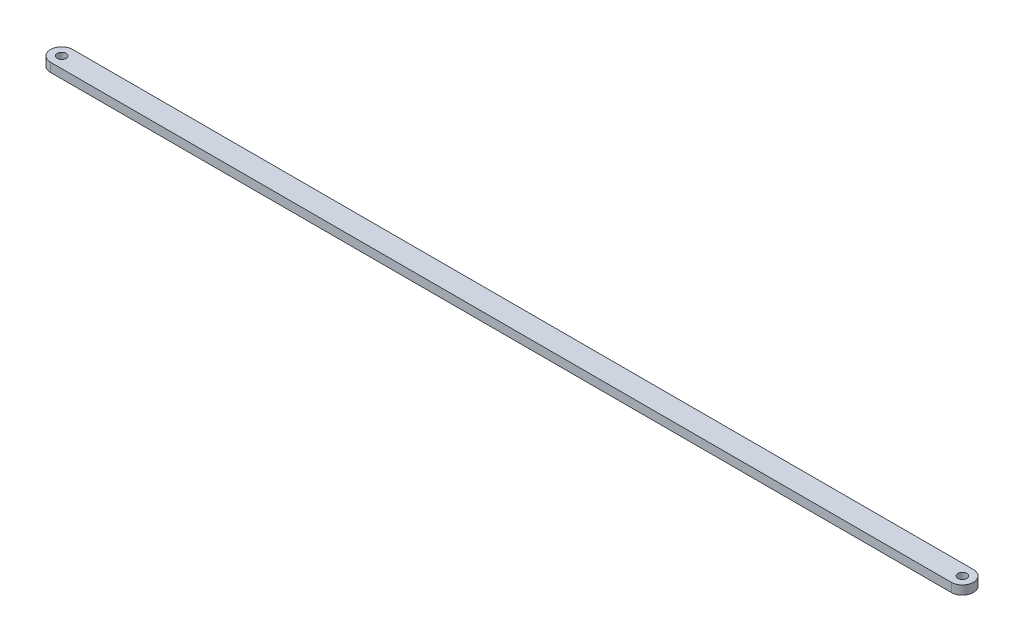
ISO-10303-21;
HEADER;
FILE_DESCRIPTION(('STEP AP214'),'2;1');
FILE_NAME('part.step','',(''),(''),'','','');
FILE_SCHEMA(('AUTOMOTIVE_DESIGN { 1 0 10303 214 1 1 1 1 }'));
ENDSEC;
DATA;
#1=APPLICATION_CONTEXT('core data for automotive mechanical design processes');
#2=APPLICATION_PROTOCOL_DEFINITION('international standard','automotive_design',2000,#1);
#3=PRODUCT_CONTEXT('',#1,'mechanical');
#4=PRODUCT('Part','Part','',(#3));
#5=PRODUCT_RELATED_PRODUCT_CATEGORY('part','',(#4));
#6=PRODUCT_DEFINITION_FORMATION('','',#4);
#7=PRODUCT_DEFINITION_CONTEXT('part definition',#1,'design');
#8=PRODUCT_DEFINITION('design','',#6,#7);
#9=PRODUCT_DEFINITION_SHAPE('','',#8);
#10=(LENGTH_UNIT() NAMED_UNIT(*) SI_UNIT(.MILLI.,.METRE.));
#11=(NAMED_UNIT(*) PLANE_ANGLE_UNIT() SI_UNIT($,.RADIAN.));
#12=(NAMED_UNIT(*) SI_UNIT($,.STERADIAN.) SOLID_ANGLE_UNIT());
#13=UNCERTAINTY_MEASURE_WITH_UNIT(LENGTH_MEASURE(1.E-05),#10,'distance_accuracy_value','');
#14=(GEOMETRIC_REPRESENTATION_CONTEXT(3) GLOBAL_UNCERTAINTY_ASSIGNED_CONTEXT((#13)) GLOBAL_UNIT_ASSIGNED_CONTEXT((#10,
#11,#12)) REPRESENTATION_CONTEXT('',''));
#15=CARTESIAN_POINT('',(0.,0.,0.));
#16=DIRECTION('',(0.,0.,1.));
#17=DIRECTION('',(1.,0.,0.));
#18=AXIS2_PLACEMENT_3D('',#15,#16,#17);
#19=CARTESIAN_POINT('',(-203.5,2.,0.));
#20=DIRECTION('',(0.,1.,0.));
#21=DIRECTION('',(0.,0.,1.));
#22=AXIS2_PLACEMENT_3D('',#19,#20,#21);
#23=PLANE('',#22);
#24=CARTESIAN_POINT('',(203.5,2.,0.));
#25=DIRECTION('',(0.,1.,0.));
#26=DIRECTION('',(0.,0.,1.));
#27=AXIS2_PLACEMENT_3D('',#24,#25,#26);
#28=CIRCLE('',#27,2.);
#29=CARTESIAN_POINT('',(203.5,2.,2.));
#30=VERTEX_POINT('',#29);
#31=EDGE_CURVE('E99',#30,#30,#28,.T.);
#32=ORIENTED_EDGE('',*,*,#31,.F.);
#33=EDGE_LOOP('',(#32));
#34=FACE_BOUND('',#33,.T.);
#35=CARTESIAN_POINT('',(-203.5,2.,0.));
#36=DIRECTION('',(0.,1.,0.));
#37=DIRECTION('',(0.,0.,1.));
#38=AXIS2_PLACEMENT_3D('',#35,#36,#37);
#39=CIRCLE('',#38,5.);
#40=CARTESIAN_POINT('',(-203.5,2.,-5.));
#41=VERTEX_POINT('',#40);
#42=CARTESIAN_POINT('',(-203.5,2.,5.));
#43=VERTEX_POINT('',#42);
#44=EDGE_CURVE('E84',#41,#43,#39,.T.);
#45=ORIENTED_EDGE('',*,*,#44,.T.);
#46=DIRECTION('',(1.,0.,0.));
#47=VECTOR('',#46,1.);
#48=CARTESIAN_POINT('',(-203.5,2.,5.));
#49=LINE('',#48,#47);
#50=CARTESIAN_POINT('',(203.5,2.,5.));
#51=VERTEX_POINT('',#50);
#52=EDGE_CURVE('E79',#43,#51,#49,.T.);
#53=ORIENTED_EDGE('',*,*,#52,.T.);
#54=CARTESIAN_POINT('',(203.5,2.,0.));
#55=DIRECTION('',(0.,1.,0.));
#56=DIRECTION('',(0.,0.,1.));
#57=AXIS2_PLACEMENT_3D('',#54,#55,#56);
#58=CIRCLE('',#57,5.);
#59=CARTESIAN_POINT('',(203.5,2.,-5.));
#60=VERTEX_POINT('',#59);
#61=EDGE_CURVE('E82',#51,#60,#58,.T.);
#62=ORIENTED_EDGE('',*,*,#61,.T.);
#63=DIRECTION('',(-1.,0.,0.));
#64=VECTOR('',#63,1.);
#65=CARTESIAN_POINT('',(-203.5,2.,-5.));
#66=LINE('',#65,#64);
#67=EDGE_CURVE('E49',#60,#41,#66,.T.);
#68=ORIENTED_EDGE('',*,*,#67,.T.);
#69=EDGE_LOOP('',(#45,#53,#62,#68));
#70=FACE_BOUND('',#69,.T.);
#71=CARTESIAN_POINT('',(-203.5,2.,0.));
#72=DIRECTION('',(0.,1.,0.));
#73=DIRECTION('',(0.,0.,-1.));
#74=AXIS2_PLACEMENT_3D('',#71,#72,#73);
#75=CIRCLE('',#74,2.);
#76=CARTESIAN_POINT('',(-203.5,2.,-2.));
#77=VERTEX_POINT('',#76);
#78=EDGE_CURVE('E114',#77,#77,#75,.T.);
#79=ORIENTED_EDGE('',*,*,#78,.F.);
#80=EDGE_LOOP('',(#79));
#81=FACE_BOUND('',#80,.T.);
#82=ADVANCED_FACE('F32',(#34,#70,#81),#23,.T.);
#83=CARTESIAN_POINT('',(-203.5,-2.,0.));
#84=DIRECTION('',(0.,1.,0.));
#85=DIRECTION('',(0.,0.,1.));
#86=AXIS2_PLACEMENT_3D('',#83,#84,#85);
#87=PLANE('',#86);
#88=CARTESIAN_POINT('',(203.5,-2.,0.));
#89=DIRECTION('',(0.,1.,0.));
#90=DIRECTION('',(0.,0.,1.));
#91=AXIS2_PLACEMENT_3D('',#88,#89,#90);
#92=CIRCLE('',#91,2.);
#93=CARTESIAN_POINT('',(203.5,-2.,2.));
#94=VERTEX_POINT('',#93);
#95=EDGE_CURVE('E111',#94,#94,#92,.T.);
#96=ORIENTED_EDGE('',*,*,#95,.T.);
#97=EDGE_LOOP('',(#96));
#98=FACE_BOUND('',#97,.T.);
#99=CARTESIAN_POINT('',(-203.5,-2.,0.));
#100=DIRECTION('',(0.,1.,0.));
#101=DIRECTION('',(0.,0.,1.));
#102=AXIS2_PLACEMENT_3D('',#99,#100,#101);
#103=CIRCLE('',#102,5.);
#104=CARTESIAN_POINT('',(-203.5,-2.,-5.));
#105=VERTEX_POINT('',#104);
#106=CARTESIAN_POINT('',(-203.5,-2.,5.));
#107=VERTEX_POINT('',#106);
#108=EDGE_CURVE('E96',#105,#107,#103,.T.);
#109=ORIENTED_EDGE('',*,*,#108,.F.);
#110=DIRECTION('',(-1.,0.,0.));
#111=VECTOR('',#110,1.);
#112=CARTESIAN_POINT('',(-203.5,-2.,-5.));
#113=LINE('',#112,#111);
#114=CARTESIAN_POINT('',(203.5,-2.,-5.));
#115=VERTEX_POINT('',#114);
#116=EDGE_CURVE('E72',#115,#105,#113,.T.);
#117=ORIENTED_EDGE('',*,*,#116,.F.);
#118=CARTESIAN_POINT('',(203.5,-2.,0.));
#119=DIRECTION('',(0.,1.,0.));
#120=DIRECTION('',(0.,0.,1.));
#121=AXIS2_PLACEMENT_3D('',#118,#119,#120);
#122=CIRCLE('',#121,5.);
#123=CARTESIAN_POINT('',(203.5,-2.,5.));
#124=VERTEX_POINT('',#123);
#125=EDGE_CURVE('E66',#124,#115,#122,.T.);
#126=ORIENTED_EDGE('',*,*,#125,.F.);
#127=DIRECTION('',(1.,0.,0.));
#128=VECTOR('',#127,1.);
#129=CARTESIAN_POINT('',(-203.5,-2.,5.));
#130=LINE('',#129,#128);
#131=EDGE_CURVE('E88',#107,#124,#130,.T.);
#132=ORIENTED_EDGE('',*,*,#131,.F.);
#133=EDGE_LOOP('',(#109,#117,#126,#132));
#134=FACE_BOUND('',#133,.T.);
#135=CARTESIAN_POINT('',(-203.5,-2.,0.));
#136=DIRECTION('',(0.,1.,0.));
#137=DIRECTION('',(0.,0.,-1.));
#138=AXIS2_PLACEMENT_3D('',#135,#136,#137);
#139=CIRCLE('',#138,2.);
#140=CARTESIAN_POINT('',(-203.5,-2.,-2.));
#141=VERTEX_POINT('',#140);
#142=EDGE_CURVE('E117',#141,#141,#139,.T.);
#143=ORIENTED_EDGE('',*,*,#142,.T.);
#144=EDGE_LOOP('',(#143));
#145=FACE_BOUND('',#144,.T.);
#146=ADVANCED_FACE('F107',(#98,#134,#145),#87,.F.);
#147=CARTESIAN_POINT('',(-203.5,2.,0.));
#148=DIRECTION('',(0.,-1.,0.));
#149=DIRECTION('',(0.,0.,-1.));
#150=AXIS2_PLACEMENT_3D('',#147,#148,#149);
#151=CYLINDRICAL_SURFACE('',#150,5.);
#152=ORIENTED_EDGE('',*,*,#108,.T.);
#153=DIRECTION('',(0.,-1.,0.));
#154=VECTOR('',#153,1.);
#155=CARTESIAN_POINT('',(-203.5,2.,5.));
#156=LINE('',#155,#154);
#157=EDGE_CURVE('E11',#43,#107,#156,.T.);
#158=ORIENTED_EDGE('',*,*,#157,.F.);
#159=ORIENTED_EDGE('',*,*,#44,.F.);
#160=DIRECTION('',(0.,-1.,0.));
#161=VECTOR('',#160,1.);
#162=CARTESIAN_POINT('',(-203.5,2.,-5.));
#163=LINE('',#162,#161);
#164=EDGE_CURVE('E92',#41,#105,#163,.T.);
#165=ORIENTED_EDGE('',*,*,#164,.T.);
#166=EDGE_LOOP('',(#152,#158,#159,#165));
#167=FACE_BOUND('',#166,.T.);
#168=ADVANCED_FACE('F34',(#167),#151,.T.);
#169=CARTESIAN_POINT('',(-203.5,2.,5.));
#170=DIRECTION('',(0.,0.,-1.));
#171=DIRECTION('',(-1.,0.,0.));
#172=AXIS2_PLACEMENT_3D('',#169,#170,#171);
#173=PLANE('',#172);
#174=ORIENTED_EDGE('',*,*,#131,.T.);
#175=DIRECTION('',(0.,-1.,0.));
#176=VECTOR('',#175,1.);
#177=CARTESIAN_POINT('',(203.5,2.,5.));
#178=LINE('',#177,#176);
#179=EDGE_CURVE('E41',#51,#124,#178,.T.);
#180=ORIENTED_EDGE('',*,*,#179,.F.);
#181=ORIENTED_EDGE('',*,*,#52,.F.);
#182=ORIENTED_EDGE('',*,*,#157,.T.);
#183=EDGE_LOOP('',(#174,#180,#181,#182));
#184=FACE_BOUND('',#183,.T.);
#185=ADVANCED_FACE('F87',(#184),#173,.F.);
#186=CARTESIAN_POINT('',(203.5,2.,0.));
#187=DIRECTION('',(0.,-1.,0.));
#188=DIRECTION('',(0.,0.,-1.));
#189=AXIS2_PLACEMENT_3D('',#186,#187,#188);
#190=CYLINDRICAL_SURFACE('',#189,5.);
#191=ORIENTED_EDGE('',*,*,#125,.T.);
#192=DIRECTION('',(0.,-1.,0.));
#193=VECTOR('',#192,1.);
#194=CARTESIAN_POINT('',(203.5,2.,-5.));
#195=LINE('',#194,#193);
#196=EDGE_CURVE('E89',#60,#115,#195,.T.);
#197=ORIENTED_EDGE('',*,*,#196,.F.);
#198=ORIENTED_EDGE('',*,*,#61,.F.);
#199=ORIENTED_EDGE('',*,*,#179,.T.);
#200=EDGE_LOOP('',(#191,#197,#198,#199));
#201=FACE_BOUND('',#200,.T.);
#202=ADVANCED_FACE('F90',(#201),#190,.T.);
#203=CARTESIAN_POINT('',(-203.5,2.,-5.));
#204=DIRECTION('',(0.,0.,1.));
#205=DIRECTION('',(1.,0.,0.));
#206=AXIS2_PLACEMENT_3D('',#203,#204,#205);
#207=PLANE('',#206);
#208=ORIENTED_EDGE('',*,*,#116,.T.);
#209=ORIENTED_EDGE('',*,*,#164,.F.);
#210=ORIENTED_EDGE('',*,*,#67,.F.);
#211=ORIENTED_EDGE('',*,*,#196,.T.);
#212=EDGE_LOOP('',(#208,#209,#210,#211));
#213=FACE_BOUND('',#212,.T.);
#214=ADVANCED_FACE('F104',(#213),#207,.F.);
#215=CARTESIAN_POINT('',(203.5,2.,0.));
#216=DIRECTION('',(0.,-1.,0.));
#217=DIRECTION('',(0.,0.,-1.));
#218=AXIS2_PLACEMENT_3D('',#215,#216,#217);
#219=CYLINDRICAL_SURFACE('',#218,2.);
#220=ORIENTED_EDGE('',*,*,#31,.T.);
#221=EDGE_LOOP('',(#220));
#222=FACE_BOUND('',#221,.T.);
#223=ORIENTED_EDGE('',*,*,#95,.F.);
#224=EDGE_LOOP('',(#223));
#225=FACE_BOUND('',#224,.T.);
#226=ADVANCED_FACE('F135',(#222,#225),#219,.F.);
#227=CARTESIAN_POINT('',(-203.5,2.,0.));
#228=DIRECTION('',(0.,-1.,0.));
#229=DIRECTION('',(0.,0.,-1.));
#230=AXIS2_PLACEMENT_3D('',#227,#228,#229);
#231=CYLINDRICAL_SURFACE('',#230,2.);
#232=ORIENTED_EDGE('',*,*,#78,.T.);
#233=EDGE_LOOP('',(#232));
#234=FACE_BOUND('',#233,.T.);
#235=ORIENTED_EDGE('',*,*,#142,.F.);
#236=EDGE_LOOP('',(#235));
#237=FACE_BOUND('',#236,.T.);
#238=ADVANCED_FACE('F123',(#234,#237),#231,.F.);
#239=CLOSED_SHELL('',(#82,#146,#168,#185,#202,#214,#226,#238));
#240=MANIFOLD_SOLID_BREP('B2',#239);
#241=ADVANCED_BREP_SHAPE_REPRESENTATION('',(#18,#240),#14);
#242=SHAPE_DEFINITION_REPRESENTATION(#9,#241);
ENDSEC;
END-ISO-10303-21;
